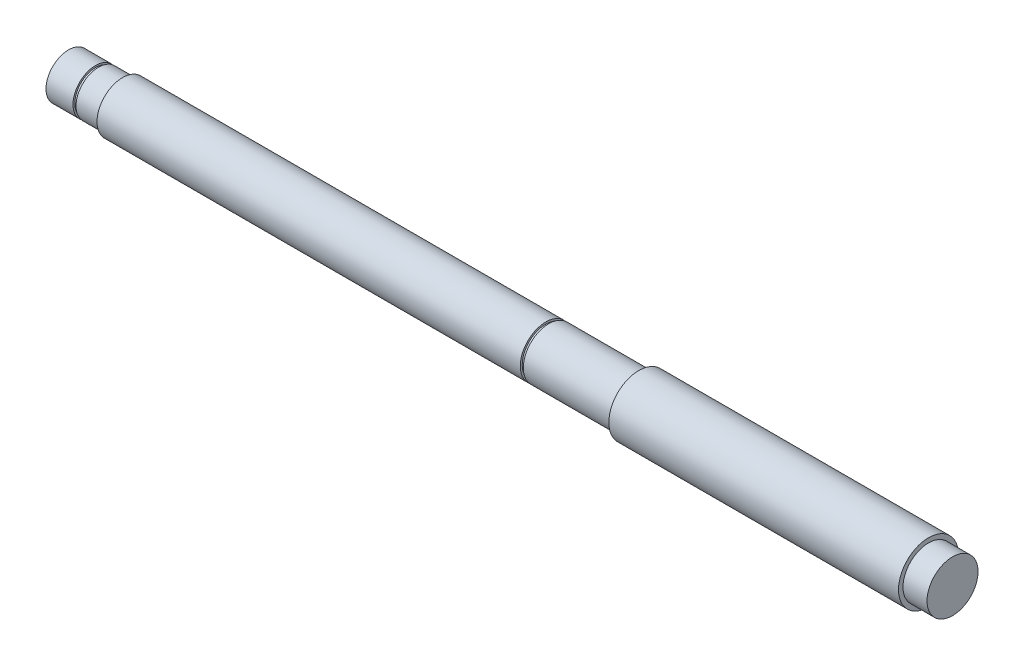
ISO-10303-21;
HEADER;
FILE_DESCRIPTION(('STEP AP214'),'2;1');
FILE_NAME('part.step','',(''),(''),'','','');
FILE_SCHEMA(('AUTOMOTIVE_DESIGN { 1 0 10303 214 1 1 1 1 }'));
ENDSEC;
DATA;
#1=APPLICATION_CONTEXT('core data for automotive mechanical design processes');
#2=APPLICATION_PROTOCOL_DEFINITION('international standard','automotive_design',2000,#1);
#3=PRODUCT_CONTEXT('',#1,'mechanical');
#4=PRODUCT('Part','Part','',(#3));
#5=PRODUCT_RELATED_PRODUCT_CATEGORY('part','',(#4));
#6=PRODUCT_DEFINITION_FORMATION('','',#4);
#7=PRODUCT_DEFINITION_CONTEXT('part definition',#1,'design');
#8=PRODUCT_DEFINITION('design','',#6,#7);
#9=PRODUCT_DEFINITION_SHAPE('','',#8);
#10=(LENGTH_UNIT() NAMED_UNIT(*) SI_UNIT(.MILLI.,.METRE.));
#11=(NAMED_UNIT(*) PLANE_ANGLE_UNIT() SI_UNIT($,.RADIAN.));
#12=(NAMED_UNIT(*) SI_UNIT($,.STERADIAN.) SOLID_ANGLE_UNIT());
#13=UNCERTAINTY_MEASURE_WITH_UNIT(LENGTH_MEASURE(1.E-05),#10,'distance_accuracy_value','');
#14=(GEOMETRIC_REPRESENTATION_CONTEXT(3) GLOBAL_UNCERTAINTY_ASSIGNED_CONTEXT((#13)) GLOBAL_UNIT_ASSIGNED_CONTEXT((#10,
#11,#12)) REPRESENTATION_CONTEXT('',''));
#15=CARTESIAN_POINT('',(0.,0.,0.));
#16=DIRECTION('',(0.,0.,1.));
#17=DIRECTION('',(1.,0.,0.));
#18=AXIS2_PLACEMENT_3D('',#15,#16,#17);
#19=CARTESIAN_POINT('',(0.,0.,0.));
#20=DIRECTION('',(1.,0.,0.));
#21=DIRECTION('',(0.,0.,-1.));
#22=AXIS2_PLACEMENT_3D('',#19,#20,#21);
#23=PLANE('',#22);
#24=CARTESIAN_POINT('',(0.,0.,0.));
#25=DIRECTION('',(-1.,0.,0.));
#26=DIRECTION('',(0.,0.,1.));
#27=AXIS2_PLACEMENT_3D('',#24,#25,#26);
#28=CIRCLE('',#27,7.5);
#29=CARTESIAN_POINT('',(0.,0.,7.5));
#30=VERTEX_POINT('',#29);
#31=EDGE_CURVE('E10',#30,#30,#28,.T.);
#32=ORIENTED_EDGE('',*,*,#31,.T.);
#33=EDGE_LOOP('',(#32));
#34=FACE_BOUND('',#33,.T.);
#35=ADVANCED_FACE('F35',(#34),#23,.F.);
#36=CARTESIAN_POINT('',(-79.5607716256805,0.,0.));
#37=DIRECTION('',(-1.,0.,0.));
#38=DIRECTION('',(0.,0.,1.));
#39=AXIS2_PLACEMENT_3D('',#36,#37,#38);
#40=CYLINDRICAL_SURFACE('',#39,7.5);
#41=ORIENTED_EDGE('',*,*,#31,.F.);
#42=EDGE_LOOP('',(#41));
#43=FACE_BOUND('',#42,.T.);
#44=CARTESIAN_POINT('',(8.99999999999999,0.,0.));
#45=DIRECTION('',(-1.,0.,0.));
#46=DIRECTION('',(0.,0.,1.));
#47=AXIS2_PLACEMENT_3D('',#44,#45,#46);
#48=CIRCLE('',#47,7.5);
#49=CARTESIAN_POINT('',(8.99999999999999,0.,7.5));
#50=VERTEX_POINT('',#49);
#51=EDGE_CURVE('E41',#50,#50,#48,.T.);
#52=ORIENTED_EDGE('',*,*,#51,.T.);
#53=EDGE_LOOP('',(#52));
#54=FACE_BOUND('',#53,.T.);
#55=ADVANCED_FACE('F103',(#43,#54),#40,.T.);
#56=CARTESIAN_POINT('',(9.,0.,-7.5));
#57=DIRECTION('',(-1.,0.,0.));
#58=DIRECTION('',(0.,0.,1.));
#59=AXIS2_PLACEMENT_3D('',#56,#57,#58);
#60=PLANE('',#59);
#61=ORIENTED_EDGE('',*,*,#51,.F.);
#62=EDGE_LOOP('',(#61));
#63=FACE_BOUND('',#62,.T.);
#64=CARTESIAN_POINT('',(8.99999999999999,0.,0.));
#65=DIRECTION('',(-1.,0.,0.));
#66=DIRECTION('',(0.,0.,1.));
#67=AXIS2_PLACEMENT_3D('',#64,#65,#66);
#68=CIRCLE('',#67,6.9);
#69=CARTESIAN_POINT('',(8.99999999999999,0.,6.9));
#70=VERTEX_POINT('',#69);
#71=EDGE_CURVE('E45',#70,#70,#68,.T.);
#72=ORIENTED_EDGE('',*,*,#71,.T.);
#73=EDGE_LOOP('',(#72));
#74=FACE_BOUND('',#73,.T.);
#75=ADVANCED_FACE('F107',(#63,#74),#60,.F.);
#76=CARTESIAN_POINT('',(-79.5607716256805,0.,0.));
#77=DIRECTION('',(-1.,0.,0.));
#78=DIRECTION('',(0.,0.,1.));
#79=AXIS2_PLACEMENT_3D('',#76,#77,#78);
#80=CYLINDRICAL_SURFACE('',#79,6.9);
#81=ORIENTED_EDGE('',*,*,#71,.F.);
#82=EDGE_LOOP('',(#81));
#83=FACE_BOUND('',#82,.T.);
#84=CARTESIAN_POINT('',(9.99999999999999,0.,0.));
#85=DIRECTION('',(-1.,0.,0.));
#86=DIRECTION('',(0.,0.,1.));
#87=AXIS2_PLACEMENT_3D('',#84,#85,#86);
#88=CIRCLE('',#87,6.9);
#89=CARTESIAN_POINT('',(9.99999999999999,0.,6.9));
#90=VERTEX_POINT('',#89);
#91=EDGE_CURVE('E49',#90,#90,#88,.T.);
#92=ORIENTED_EDGE('',*,*,#91,.T.);
#93=EDGE_LOOP('',(#92));
#94=FACE_BOUND('',#93,.T.);
#95=ADVANCED_FACE('F112',(#83,#94),#80,.T.);
#96=CARTESIAN_POINT('',(10.,0.,-6.9));
#97=DIRECTION('',(1.,0.,0.));
#98=DIRECTION('',(0.,0.,-1.));
#99=AXIS2_PLACEMENT_3D('',#96,#97,#98);
#100=PLANE('',#99);
#101=ORIENTED_EDGE('',*,*,#91,.F.);
#102=EDGE_LOOP('',(#101));
#103=FACE_BOUND('',#102,.T.);
#104=CARTESIAN_POINT('',(9.99999999999999,0.,0.));
#105=DIRECTION('',(-1.,0.,0.));
#106=DIRECTION('',(0.,0.,1.));
#107=AXIS2_PLACEMENT_3D('',#104,#105,#106);
#108=CIRCLE('',#107,7.5);
#109=CARTESIAN_POINT('',(9.99999999999999,0.,7.5));
#110=VERTEX_POINT('',#109);
#111=EDGE_CURVE('E54',#110,#110,#108,.T.);
#112=ORIENTED_EDGE('',*,*,#111,.T.);
#113=EDGE_LOOP('',(#112));
#114=FACE_BOUND('',#113,.T.);
#115=ADVANCED_FACE('F118',(#103,#114),#100,.F.);
#116=CARTESIAN_POINT('',(-79.5607716256805,0.,0.));
#117=DIRECTION('',(-1.,0.,0.));
#118=DIRECTION('',(0.,0.,1.));
#119=AXIS2_PLACEMENT_3D('',#116,#117,#118);
#120=CYLINDRICAL_SURFACE('',#119,7.5);
#121=ORIENTED_EDGE('',*,*,#111,.F.);
#122=EDGE_LOOP('',(#121));
#123=FACE_BOUND('',#122,.T.);
#124=CARTESIAN_POINT('',(18.,0.,0.));
#125=DIRECTION('',(-1.,0.,0.));
#126=DIRECTION('',(0.,0.,1.));
#127=AXIS2_PLACEMENT_3D('',#124,#125,#126);
#128=CIRCLE('',#127,7.5);
#129=CARTESIAN_POINT('',(18.,0.,7.5));
#130=VERTEX_POINT('',#129);
#131=EDGE_CURVE('E57',#130,#130,#128,.T.);
#132=ORIENTED_EDGE('',*,*,#131,.T.);
#133=EDGE_LOOP('',(#132));
#134=FACE_BOUND('',#133,.T.);
#135=ADVANCED_FACE('F122',(#123,#134),#120,.T.);
#136=CARTESIAN_POINT('',(18.,0.,-7.5));
#137=DIRECTION('',(1.,0.,0.));
#138=DIRECTION('',(0.,0.,-1.));
#139=AXIS2_PLACEMENT_3D('',#136,#137,#138);
#140=PLANE('',#139);
#141=ORIENTED_EDGE('',*,*,#131,.F.);
#142=EDGE_LOOP('',(#141));
#143=FACE_BOUND('',#142,.T.);
#144=CARTESIAN_POINT('',(18.,0.,0.));
#145=DIRECTION('',(-1.,0.,0.));
#146=DIRECTION('',(0.,0.,1.));
#147=AXIS2_PLACEMENT_3D('',#144,#145,#146);
#148=CIRCLE('',#147,8.5);
#149=CARTESIAN_POINT('',(18.,0.,8.5));
#150=VERTEX_POINT('',#149);
#151=EDGE_CURVE('E60',#150,#150,#148,.T.);
#152=ORIENTED_EDGE('',*,*,#151,.T.);
#153=EDGE_LOOP('',(#152));
#154=FACE_BOUND('',#153,.T.);
#155=ADVANCED_FACE('F126',(#143,#154),#140,.F.);
#156=CARTESIAN_POINT('',(-79.5607716256805,0.,0.));
#157=DIRECTION('',(-1.,0.,0.));
#158=DIRECTION('',(0.,0.,1.));
#159=AXIS2_PLACEMENT_3D('',#156,#157,#158);
#160=CYLINDRICAL_SURFACE('',#159,8.5);
#161=ORIENTED_EDGE('',*,*,#151,.F.);
#162=EDGE_LOOP('',(#161));
#163=FACE_BOUND('',#162,.T.);
#164=CARTESIAN_POINT('',(159.,0.,0.));
#165=DIRECTION('',(-1.,0.,0.));
#166=DIRECTION('',(0.,0.,1.));
#167=AXIS2_PLACEMENT_3D('',#164,#165,#166);
#168=CIRCLE('',#167,8.5);
#169=CARTESIAN_POINT('',(159.,0.,8.5));
#170=VERTEX_POINT('',#169);
#171=EDGE_CURVE('E63',#170,#170,#168,.T.);
#172=ORIENTED_EDGE('',*,*,#171,.T.);
#173=EDGE_LOOP('',(#172));
#174=FACE_BOUND('',#173,.T.);
#175=ADVANCED_FACE('F130',(#163,#174),#160,.T.);
#176=CARTESIAN_POINT('',(159.,0.,-8.5));
#177=DIRECTION('',(-1.,0.,0.));
#178=DIRECTION('',(0.,0.,1.));
#179=AXIS2_PLACEMENT_3D('',#176,#177,#178);
#180=PLANE('',#179);
#181=ORIENTED_EDGE('',*,*,#171,.F.);
#182=EDGE_LOOP('',(#181));
#183=FACE_BOUND('',#182,.T.);
#184=CARTESIAN_POINT('',(159.,0.,0.));
#185=DIRECTION('',(-1.,0.,0.));
#186=DIRECTION('',(0.,0.,1.));
#187=AXIS2_PLACEMENT_3D('',#184,#185,#186);
#188=CIRCLE('',#187,7.85);
#189=CARTESIAN_POINT('',(159.,0.,7.85));
#190=VERTEX_POINT('',#189);
#191=EDGE_CURVE('E66',#190,#190,#188,.T.);
#192=ORIENTED_EDGE('',*,*,#191,.T.);
#193=EDGE_LOOP('',(#192));
#194=FACE_BOUND('',#193,.T.);
#195=ADVANCED_FACE('F134',(#183,#194),#180,.F.);
#196=CARTESIAN_POINT('',(-79.5607716256805,0.,0.));
#197=DIRECTION('',(-1.,0.,0.));
#198=DIRECTION('',(0.,0.,1.));
#199=AXIS2_PLACEMENT_3D('',#196,#197,#198);
#200=CYLINDRICAL_SURFACE('',#199,7.85);
#201=ORIENTED_EDGE('',*,*,#191,.F.);
#202=EDGE_LOOP('',(#201));
#203=FACE_BOUND('',#202,.T.);
#204=CARTESIAN_POINT('',(160.,0.,0.));
#205=DIRECTION('',(-1.,0.,0.));
#206=DIRECTION('',(0.,0.,1.));
#207=AXIS2_PLACEMENT_3D('',#204,#205,#206);
#208=CIRCLE('',#207,7.85);
#209=CARTESIAN_POINT('',(160.,0.,7.85));
#210=VERTEX_POINT('',#209);
#211=EDGE_CURVE('E69',#210,#210,#208,.T.);
#212=ORIENTED_EDGE('',*,*,#211,.T.);
#213=EDGE_LOOP('',(#212));
#214=FACE_BOUND('',#213,.T.);
#215=ADVANCED_FACE('F138',(#203,#214),#200,.T.);
#216=CARTESIAN_POINT('',(160.,0.,-7.85));
#217=DIRECTION('',(1.,0.,0.));
#218=DIRECTION('',(0.,0.,-1.));
#219=AXIS2_PLACEMENT_3D('',#216,#217,#218);
#220=PLANE('',#219);
#221=ORIENTED_EDGE('',*,*,#211,.F.);
#222=EDGE_LOOP('',(#221));
#223=FACE_BOUND('',#222,.T.);
#224=CARTESIAN_POINT('',(160.,0.,0.));
#225=DIRECTION('',(-1.,0.,0.));
#226=DIRECTION('',(0.,0.,1.));
#227=AXIS2_PLACEMENT_3D('',#224,#225,#226);
#228=CIRCLE('',#227,8.5);
#229=CARTESIAN_POINT('',(160.,0.,8.5));
#230=VERTEX_POINT('',#229);
#231=EDGE_CURVE('E72',#230,#230,#228,.T.);
#232=ORIENTED_EDGE('',*,*,#231,.T.);
#233=EDGE_LOOP('',(#232));
#234=FACE_BOUND('',#233,.T.);
#235=ADVANCED_FACE('F142',(#223,#234),#220,.F.);
#236=CARTESIAN_POINT('',(-79.5607716256805,0.,0.));
#237=DIRECTION('',(-1.,0.,0.));
#238=DIRECTION('',(0.,0.,1.));
#239=AXIS2_PLACEMENT_3D('',#236,#237,#238);
#240=CYLINDRICAL_SURFACE('',#239,8.5);
#241=ORIENTED_EDGE('',*,*,#231,.F.);
#242=EDGE_LOOP('',(#241));
#243=FACE_BOUND('',#242,.T.);
#244=CARTESIAN_POINT('',(190.,0.,0.));
#245=DIRECTION('',(-1.,0.,0.));
#246=DIRECTION('',(0.,0.,1.));
#247=AXIS2_PLACEMENT_3D('',#244,#245,#246);
#248=CIRCLE('',#247,8.5);
#249=CARTESIAN_POINT('',(190.,0.,8.5));
#250=VERTEX_POINT('',#249);
#251=EDGE_CURVE('E75',#250,#250,#248,.T.);
#252=ORIENTED_EDGE('',*,*,#251,.T.);
#253=EDGE_LOOP('',(#252));
#254=FACE_BOUND('',#253,.T.);
#255=ADVANCED_FACE('F146',(#243,#254),#240,.T.);
#256=CARTESIAN_POINT('',(190.,0.,-8.5));
#257=DIRECTION('',(1.,0.,0.));
#258=DIRECTION('',(0.,0.,-1.));
#259=AXIS2_PLACEMENT_3D('',#256,#257,#258);
#260=PLANE('',#259);
#261=ORIENTED_EDGE('',*,*,#251,.F.);
#262=EDGE_LOOP('',(#261));
#263=FACE_BOUND('',#262,.T.);
#264=CARTESIAN_POINT('',(190.,0.,0.));
#265=DIRECTION('',(-1.,0.,0.));
#266=DIRECTION('',(0.,0.,1.));
#267=AXIS2_PLACEMENT_3D('',#264,#265,#266);
#268=CIRCLE('',#267,10.);
#269=CARTESIAN_POINT('',(190.,0.,10.));
#270=VERTEX_POINT('',#269);
#271=EDGE_CURVE('E78',#270,#270,#268,.T.);
#272=ORIENTED_EDGE('',*,*,#271,.T.);
#273=EDGE_LOOP('',(#272));
#274=FACE_BOUND('',#273,.T.);
#275=ADVANCED_FACE('F150',(#263,#274),#260,.F.);
#276=CARTESIAN_POINT('',(-79.5607716256805,0.,0.));
#277=DIRECTION('',(-1.,0.,0.));
#278=DIRECTION('',(0.,0.,1.));
#279=AXIS2_PLACEMENT_3D('',#276,#277,#278);
#280=CYLINDRICAL_SURFACE('',#279,10.);
#281=ORIENTED_EDGE('',*,*,#271,.F.);
#282=EDGE_LOOP('',(#281));
#283=FACE_BOUND('',#282,.T.);
#284=CARTESIAN_POINT('',(286.5,0.,0.));
#285=DIRECTION('',(-1.,0.,0.));
#286=DIRECTION('',(0.,0.,1.));
#287=AXIS2_PLACEMENT_3D('',#284,#285,#286);
#288=CIRCLE('',#287,10.);
#289=CARTESIAN_POINT('',(286.5,0.,10.));
#290=VERTEX_POINT('',#289);
#291=EDGE_CURVE('E81',#290,#290,#288,.T.);
#292=ORIENTED_EDGE('',*,*,#291,.T.);
#293=EDGE_LOOP('',(#292));
#294=FACE_BOUND('',#293,.T.);
#295=ADVANCED_FACE('F154',(#283,#294),#280,.T.);
#296=CARTESIAN_POINT('',(286.5,0.,-10.));
#297=DIRECTION('',(-1.,0.,0.));
#298=DIRECTION('',(0.,0.,1.));
#299=AXIS2_PLACEMENT_3D('',#296,#297,#298);
#300=PLANE('',#299);
#301=ORIENTED_EDGE('',*,*,#291,.F.);
#302=EDGE_LOOP('',(#301));
#303=FACE_BOUND('',#302,.T.);
#304=CARTESIAN_POINT('',(286.5,0.,0.));
#305=DIRECTION('',(-1.,0.,0.));
#306=DIRECTION('',(0.,0.,1.));
#307=AXIS2_PLACEMENT_3D('',#304,#305,#306);
#308=CIRCLE('',#307,8.5);
#309=CARTESIAN_POINT('',(286.5,0.,8.5));
#310=VERTEX_POINT('',#309);
#311=EDGE_CURVE('E84',#310,#310,#308,.T.);
#312=ORIENTED_EDGE('',*,*,#311,.T.);
#313=EDGE_LOOP('',(#312));
#314=FACE_BOUND('',#313,.T.);
#315=ADVANCED_FACE('F99',(#303,#314),#300,.F.);
#316=CARTESIAN_POINT('',(-79.5607716256805,0.,0.));
#317=DIRECTION('',(-1.,0.,0.));
#318=DIRECTION('',(0.,0.,1.));
#319=AXIS2_PLACEMENT_3D('',#316,#317,#318);
#320=CYLINDRICAL_SURFACE('',#319,8.5);
#321=ORIENTED_EDGE('',*,*,#311,.F.);
#322=EDGE_LOOP('',(#321));
#323=FACE_BOUND('',#322,.T.);
#324=CARTESIAN_POINT('',(294.5,0.,0.));
#325=DIRECTION('',(-1.,0.,0.));
#326=DIRECTION('',(0.,0.,1.));
#327=AXIS2_PLACEMENT_3D('',#324,#325,#326);
#328=CIRCLE('',#327,8.5);
#329=CARTESIAN_POINT('',(294.5,0.,8.5));
#330=VERTEX_POINT('',#329);
#331=EDGE_CURVE('E87',#330,#330,#328,.T.);
#332=ORIENTED_EDGE('',*,*,#331,.T.);
#333=EDGE_LOOP('',(#332));
#334=FACE_BOUND('',#333,.T.);
#335=ADVANCED_FACE('F91',(#323,#334),#320,.T.);
#336=CARTESIAN_POINT('',(294.5,0.,-8.5));
#337=DIRECTION('',(-1.,0.,0.));
#338=DIRECTION('',(0.,0.,1.));
#339=AXIS2_PLACEMENT_3D('',#336,#337,#338);
#340=PLANE('',#339);
#341=ORIENTED_EDGE('',*,*,#331,.F.);
#342=EDGE_LOOP('',(#341));
#343=FACE_BOUND('',#342,.T.);
#344=ADVANCED_FACE('F93',(#343),#340,.F.);
#345=CLOSED_SHELL('',(#35,#55,#75,#95,#115,#135,#155,#175,#195,#215,#235,#255,#275,#295,#315,
#335,#344));
#346=MANIFOLD_SOLID_BREP('B2',#345);
#347=ADVANCED_BREP_SHAPE_REPRESENTATION('',(#18,#346),#14);
#348=SHAPE_DEFINITION_REPRESENTATION(#9,#347);
ENDSEC;
END-ISO-10303-21;
